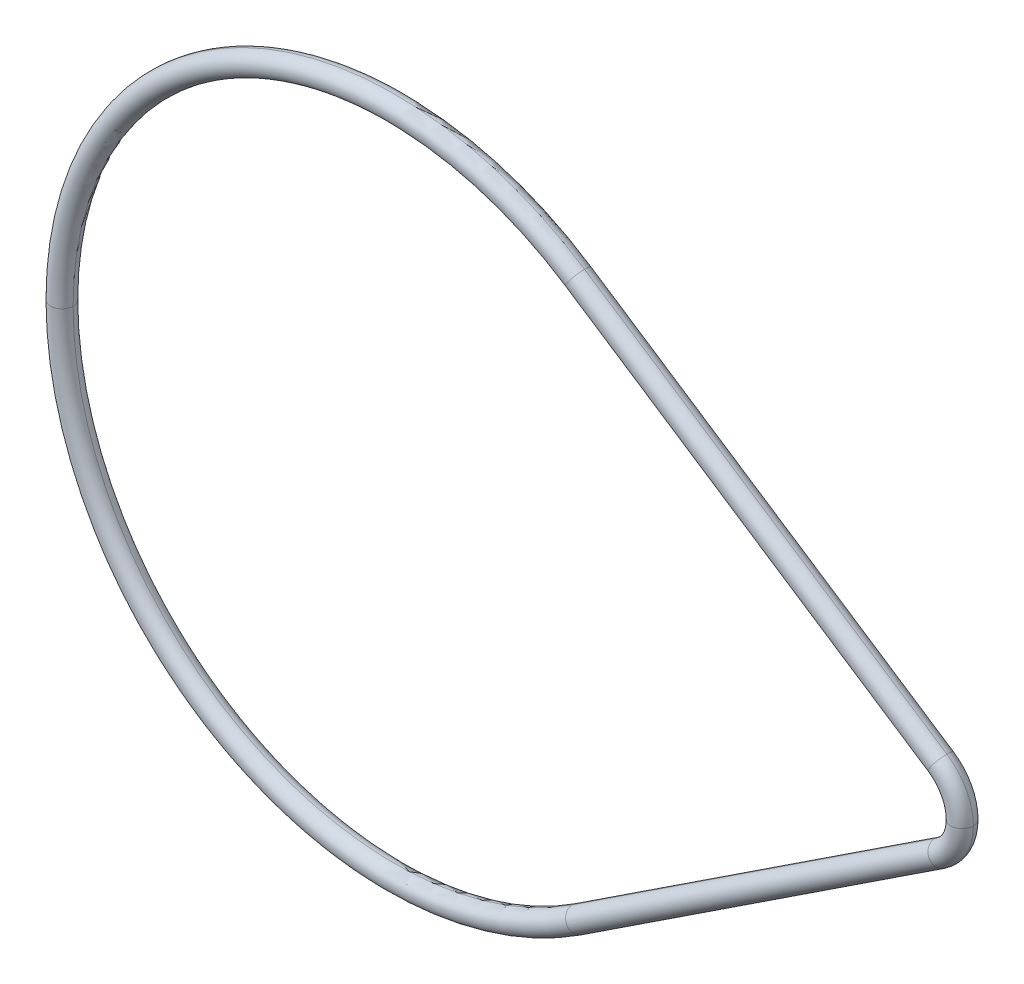
ISO-10303-21;
HEADER;
FILE_DESCRIPTION(('STEP AP214'),'2;1');
FILE_NAME('part.step','',(''),(''),'','','');
FILE_SCHEMA(('AUTOMOTIVE_DESIGN { 1 0 10303 214 1 1 1 1 }'));
ENDSEC;
DATA;
#1=APPLICATION_CONTEXT('core data for automotive mechanical design processes');
#2=APPLICATION_PROTOCOL_DEFINITION('international standard','automotive_design',2000,#1);
#3=PRODUCT_CONTEXT('',#1,'mechanical');
#4=PRODUCT('Part','Part','',(#3));
#5=PRODUCT_RELATED_PRODUCT_CATEGORY('part','',(#4));
#6=PRODUCT_DEFINITION_FORMATION('','',#4);
#7=PRODUCT_DEFINITION_CONTEXT('part definition',#1,'design');
#8=PRODUCT_DEFINITION('design','',#6,#7);
#9=PRODUCT_DEFINITION_SHAPE('','',#8);
#10=(LENGTH_UNIT() NAMED_UNIT(*) SI_UNIT(.MILLI.,.METRE.));
#11=(NAMED_UNIT(*) PLANE_ANGLE_UNIT() SI_UNIT($,.RADIAN.));
#12=(NAMED_UNIT(*) SI_UNIT($,.STERADIAN.) SOLID_ANGLE_UNIT());
#13=UNCERTAINTY_MEASURE_WITH_UNIT(LENGTH_MEASURE(1.E-05),#10,'distance_accuracy_value','');
#14=(GEOMETRIC_REPRESENTATION_CONTEXT(3) GLOBAL_UNCERTAINTY_ASSIGNED_CONTEXT((#13)) GLOBAL_UNIT_ASSIGNED_CONTEXT((#10,
#11,#12)) REPRESENTATION_CONTEXT('',''));
#15=CARTESIAN_POINT('',(0.,0.,0.));
#16=DIRECTION('',(0.,0.,1.));
#17=DIRECTION('',(1.,0.,0.));
#18=AXIS2_PLACEMENT_3D('',#15,#16,#17);
#19=CARTESIAN_POINT('',(46.,0.,0.));
#20=DIRECTION('',(0.,0.,1.));
#21=DIRECTION('',(1.,0.,0.));
#22=AXIS2_PLACEMENT_3D('',#19,#20,#21);
#23=TOROIDAL_SURFACE('',#22,4.2,0.995);
#24=CARTESIAN_POINT('',(46.,0.,0.));
#25=DIRECTION('',(0.,0.,1.));
#26=DIRECTION('',(0.550000000014294,-0.83516465441509,0.));
#27=AXIS2_PLACEMENT_3D('',#24,#25,#26);
#28=CIRCLE('',#27,3.205);
#29=CARTESIAN_POINT('',(47.76275000005,-2.6767027174,0.));
#30=VERTEX_POINT('',#29);
#31=CARTESIAN_POINT('',(49.205,0.,0.));
#32=VERTEX_POINT('',#31);
#33=EDGE_CURVE('E11',#30,#32,#28,.T.);
#34=ORIENTED_EDGE('',*,*,#33,.T.);
#35=CARTESIAN_POINT('',(50.2,0.,0.));
#36=DIRECTION('',(0.,-1.,0.));
#37=DIRECTION('',(-1.,0.,0.));
#38=AXIS2_PLACEMENT_3D('',#35,#36,#37);
#39=CIRCLE('',#38,0.995);
#40=CARTESIAN_POINT('',(51.195,0.,0.));
#41=VERTEX_POINT('',#40);
#42=EDGE_CURVE('E29',#32,#41,#39,.T.);
#43=ORIENTED_EDGE('',*,*,#42,.T.);
#44=CARTESIAN_POINT('',(46.,0.,0.));
#45=DIRECTION('',(0.,0.,1.));
#46=DIRECTION('',(0.550000000014294,-0.83516465441509,0.));
#47=AXIS2_PLACEMENT_3D('',#44,#45,#46);
#48=CIRCLE('',#47,5.195);
#49=CARTESIAN_POINT('',(48.85725000007,-4.338680379686,0.));
#50=VERTEX_POINT('',#49);
#51=EDGE_CURVE('E212',#50,#41,#48,.T.);
#52=ORIENTED_EDGE('',*,*,#51,.F.);
#53=CARTESIAN_POINT('',(48.31000000006,-3.507691548543,0.));
#54=DIRECTION('',(0.83516465441509,0.550000000014294,0.));
#55=DIRECTION('',(0.550000000014294,-0.83516465441509,0.));
#56=AXIS2_PLACEMENT_3D('',#53,#54,#55);
#57=CIRCLE('',#56,0.995);
#58=EDGE_CURVE('E196',#50,#30,#57,.T.);
#59=ORIENTED_EDGE('',*,*,#58,.T.);
#60=EDGE_LOOP('',(#34,#43,#52,#59));
#61=FACE_BOUND('',#60,.T.);
#62=ADVANCED_FACE('F18',(#61),#23,.T.);
#63=CARTESIAN_POINT('',(16.22500000006,-24.63735730548,0.));
#64=DIRECTION('',(0.835164654424502,0.55,0.));
#65=DIRECTION('',(-0.55,0.835164654424502,0.));
#66=AXIS2_PLACEMENT_3D('',#63,#64,#65);
#67=CYLINDRICAL_SURFACE('',#66,0.995);
#68=DIRECTION('',(0.835164654424502,0.55,0.));
#69=VECTOR('',#68,1.);
#70=CARTESIAN_POINT('',(15.67775000006,-23.80636847433,0.));
#71=LINE('',#70,#69);
#72=CARTESIAN_POINT('',(15.67775000006,-23.80636847433,0.));
#73=VERTEX_POINT('',#72);
#74=EDGE_CURVE('E200',#73,#30,#71,.T.);
#75=ORIENTED_EDGE('',*,*,#74,.T.);
#76=ORIENTED_EDGE('',*,*,#58,.F.);
#77=DIRECTION('',(0.835164654424502,0.55,0.));
#78=VECTOR('',#77,1.);
#79=CARTESIAN_POINT('',(16.77225000006,-25.46834613664,0.));
#80=LINE('',#79,#78);
#81=CARTESIAN_POINT('',(16.77225000006,-25.46834613664,0.));
#82=VERTEX_POINT('',#81);
#83=EDGE_CURVE('E214',#82,#50,#80,.T.);
#84=ORIENTED_EDGE('',*,*,#83,.F.);
#85=CARTESIAN_POINT('',(16.22500000006,-24.63735730548,0.));
#86=DIRECTION('',(-0.83516465442319,-0.550000000001994,0.));
#87=DIRECTION('',(-0.550000000001994,0.83516465442319,0.));
#88=AXIS2_PLACEMENT_3D('',#85,#86,#87);
#89=CIRCLE('',#88,0.995);
#90=EDGE_CURVE('E190',#73,#82,#89,.T.);
#91=ORIENTED_EDGE('',*,*,#90,.F.);
#92=EDGE_LOOP('',(#75,#76,#84,#91));
#93=FACE_BOUND('',#92,.T.);
#94=ADVANCED_FACE('F366',(#93),#67,.T.);
#95=CARTESIAN_POINT('',(0.,0.,0.));
#96=DIRECTION('',(0.,0.,-1.));
#97=DIRECTION('',(-1.,0.,0.));
#98=AXIS2_PLACEMENT_3D('',#95,#96,#97);
#99=TOROIDAL_SURFACE('',#98,29.5,0.995);
#100=CARTESIAN_POINT('',(0.,0.,0.));
#101=DIRECTION('',(0.,0.,-1.));
#102=DIRECTION('',(0.550000000001994,-0.83516465442319,0.));
#103=AXIS2_PLACEMENT_3D('',#100,#101,#102);
#104=CIRCLE('',#103,30.495);
#105=CARTESIAN_POINT('',(-30.495,0.,0.));
#106=VERTEX_POINT('',#105);
#107=EDGE_CURVE('E219',#82,#106,#104,.T.);
#108=ORIENTED_EDGE('',*,*,#107,.T.);
#109=CARTESIAN_POINT('',(-29.5,0.,0.));
#110=DIRECTION('',(0.,-1.,0.));
#111=DIRECTION('',(-1.,0.,0.));
#112=AXIS2_PLACEMENT_3D('',#109,#110,#111);
#113=CIRCLE('',#112,0.995);
#114=CARTESIAN_POINT('',(-28.505,0.,0.));
#115=VERTEX_POINT('',#114);
#116=EDGE_CURVE('E194',#106,#115,#113,.T.);
#117=ORIENTED_EDGE('',*,*,#116,.T.);
#118=CARTESIAN_POINT('',(0.,0.,0.));
#119=DIRECTION('',(0.,0.,-1.));
#120=DIRECTION('',(0.550000000001994,-0.83516465442319,0.));
#121=AXIS2_PLACEMENT_3D('',#118,#119,#120);
#122=CIRCLE('',#121,28.505);
#123=EDGE_CURVE('E195',#73,#115,#122,.T.);
#124=ORIENTED_EDGE('',*,*,#123,.F.);
#125=ORIENTED_EDGE('',*,*,#90,.T.);
#126=EDGE_LOOP('',(#108,#117,#124,#125));
#127=FACE_BOUND('',#126,.T.);
#128=ADVANCED_FACE('F344',(#127),#99,.T.);
#129=CARTESIAN_POINT('',(0.,0.,0.));
#130=DIRECTION('',(0.,0.,-1.));
#131=DIRECTION('',(-1.,0.,0.));
#132=AXIS2_PLACEMENT_3D('',#129,#130,#131);
#133=TOROIDAL_SURFACE('',#132,29.5,0.995);
#134=ORIENTED_EDGE('',*,*,#123,.T.);
#135=CARTESIAN_POINT('',(-29.5,0.,0.));
#136=DIRECTION('',(0.,-1.,0.));
#137=DIRECTION('',(1.,0.,0.));
#138=AXIS2_PLACEMENT_3D('',#135,#136,#137);
#139=CIRCLE('',#138,0.995);
#140=EDGE_CURVE('E211',#115,#106,#139,.T.);
#141=ORIENTED_EDGE('',*,*,#140,.T.);
#142=ORIENTED_EDGE('',*,*,#107,.F.);
#143=CARTESIAN_POINT('',(16.22500000006,-24.63735730548,0.));
#144=DIRECTION('',(-0.83516465442319,-0.550000000001994,0.));
#145=DIRECTION('',(0.550000000001994,-0.83516465442319,0.));
#146=AXIS2_PLACEMENT_3D('',#143,#144,#145);
#147=CIRCLE('',#146,0.995);
#148=EDGE_CURVE('E281',#82,#73,#147,.T.);
#149=ORIENTED_EDGE('',*,*,#148,.T.);
#150=EDGE_LOOP('',(#134,#141,#142,#149));
#151=FACE_BOUND('',#150,.T.);
#152=ADVANCED_FACE('F353',(#151),#133,.T.);
#153=CARTESIAN_POINT('',(16.22500000006,-24.63735730548,0.));
#154=DIRECTION('',(0.835164654424502,0.55,0.));
#155=DIRECTION('',(-0.55,0.835164654424502,0.));
#156=AXIS2_PLACEMENT_3D('',#153,#154,#155);
#157=CYLINDRICAL_SURFACE('',#156,0.995);
#158=ORIENTED_EDGE('',*,*,#83,.T.);
#159=CARTESIAN_POINT('',(48.31000000006,-3.507691548543,0.));
#160=DIRECTION('',(0.83516465441509,0.550000000014294,0.));
#161=DIRECTION('',(-0.550000000014294,0.83516465441509,0.));
#162=AXIS2_PLACEMENT_3D('',#159,#160,#161);
#163=CIRCLE('',#162,0.995);
#164=EDGE_CURVE('E160',#30,#50,#163,.T.);
#165=ORIENTED_EDGE('',*,*,#164,.F.);
#166=ORIENTED_EDGE('',*,*,#74,.F.);
#167=ORIENTED_EDGE('',*,*,#148,.F.);
#168=EDGE_LOOP('',(#158,#165,#166,#167));
#169=FACE_BOUND('',#168,.T.);
#170=ADVANCED_FACE('F357',(#169),#157,.T.);
#171=CARTESIAN_POINT('',(46.,0.,0.));
#172=DIRECTION('',(0.,0.,1.));
#173=DIRECTION('',(1.,0.,0.));
#174=AXIS2_PLACEMENT_3D('',#171,#172,#173);
#175=TOROIDAL_SURFACE('',#174,4.2,0.995);
#176=ORIENTED_EDGE('',*,*,#51,.T.);
#177=CARTESIAN_POINT('',(50.2,0.,0.));
#178=DIRECTION('',(0.,-1.,0.));
#179=DIRECTION('',(1.,0.,0.));
#180=AXIS2_PLACEMENT_3D('',#177,#178,#179);
#181=CIRCLE('',#180,0.995);
#182=EDGE_CURVE('E43',#41,#32,#181,.T.);
#183=ORIENTED_EDGE('',*,*,#182,.T.);
#184=ORIENTED_EDGE('',*,*,#33,.F.);
#185=ORIENTED_EDGE('',*,*,#164,.T.);
#186=EDGE_LOOP('',(#176,#183,#184,#185));
#187=FACE_BOUND('',#186,.T.);
#188=ADVANCED_FACE('F368',(#187),#175,.T.);
#189=CARTESIAN_POINT('',(46.,0.,0.));
#190=DIRECTION('',(0.,0.,1.));
#191=DIRECTION('',(1.,0.,0.));
#192=AXIS2_PLACEMENT_3D('',#189,#190,#191);
#193=TOROIDAL_SURFACE('',#192,4.2,0.995);
#194=CARTESIAN_POINT('',(46.,0.,0.));
#195=DIRECTION('',(0.,0.,1.));
#196=DIRECTION('',(1.,0.,0.));
#197=AXIS2_PLACEMENT_3D('',#194,#195,#196);
#198=CIRCLE('',#197,3.205);
#199=CARTESIAN_POINT('',(47.76274999996,2.67670271746,0.));
#200=VERTEX_POINT('',#199);
#201=EDGE_CURVE('E143',#32,#200,#198,.T.);
#202=ORIENTED_EDGE('',*,*,#201,.F.);
#203=ORIENTED_EDGE('',*,*,#182,.F.);
#204=CARTESIAN_POINT('',(46.,0.,0.));
#205=DIRECTION('',(0.,0.,1.));
#206=DIRECTION('',(1.,0.,0.));
#207=AXIS2_PLACEMENT_3D('',#204,#205,#206);
#208=CIRCLE('',#207,5.195);
#209=CARTESIAN_POINT('',(48.85724999993,4.338680379783,0.));
#210=VERTEX_POINT('',#209);
#211=EDGE_CURVE('E154',#41,#210,#208,.T.);
#212=ORIENTED_EDGE('',*,*,#211,.T.);
#213=CARTESIAN_POINT('',(48.30999999994,3.507691548622,0.));
#214=DIRECTION('',(0.835164654433716,-0.549999999986011,0.));
#215=DIRECTION('',(0.549999999986011,0.835164654433716,0.));
#216=AXIS2_PLACEMENT_3D('',#213,#214,#215);
#217=CIRCLE('',#216,0.995);
#218=EDGE_CURVE('E147',#210,#200,#217,.T.);
#219=ORIENTED_EDGE('',*,*,#218,.T.);
#220=EDGE_LOOP('',(#202,#203,#212,#219));
#221=FACE_BOUND('',#220,.T.);
#222=ADVANCED_FACE('F157',(#221),#193,.T.);
#223=CARTESIAN_POINT('',(16.22499999994,24.63735730556,0.));
#224=DIRECTION('',(0.835164654424502,-0.55,0.));
#225=DIRECTION('',(0.55,0.835164654424502,0.));
#226=AXIS2_PLACEMENT_3D('',#223,#224,#225);
#227=CYLINDRICAL_SURFACE('',#226,0.995);
#228=DIRECTION('',(0.835164654424502,-0.55,0.));
#229=VECTOR('',#228,1.);
#230=CARTESIAN_POINT('',(15.67775000008,23.80636847432,0.));
#231=LINE('',#230,#229);
#232=CARTESIAN_POINT('',(15.67775000008,23.80636847432,0.));
#233=VERTEX_POINT('',#232);
#234=EDGE_CURVE('E150',#233,#200,#231,.T.);
#235=ORIENTED_EDGE('',*,*,#234,.T.);
#236=ORIENTED_EDGE('',*,*,#218,.F.);
#237=DIRECTION('',(0.835164654424502,-0.55,0.));
#238=VECTOR('',#237,1.);
#239=CARTESIAN_POINT('',(16.77225000008,25.46834613662,0.));
#240=LINE('',#239,#238);
#241=CARTESIAN_POINT('',(16.77225000008,25.46834613662,0.));
#242=VERTEX_POINT('',#241);
#243=EDGE_CURVE('E132',#242,#210,#240,.T.);
#244=ORIENTED_EDGE('',*,*,#243,.F.);
#245=CARTESIAN_POINT('',(16.22500000008,24.63735730547,0.));
#246=DIRECTION('',(-0.835164654422718,0.550000000002712,0.));
#247=DIRECTION('',(-0.550000000002712,-0.835164654422718,0.));
#248=AXIS2_PLACEMENT_3D('',#245,#246,#247);
#249=CIRCLE('',#248,0.995);
#250=EDGE_CURVE('E206',#233,#242,#249,.T.);
#251=ORIENTED_EDGE('',*,*,#250,.F.);
#252=EDGE_LOOP('',(#235,#236,#244,#251));
#253=FACE_BOUND('',#252,.T.);
#254=ADVANCED_FACE('F149',(#253),#227,.T.);
#255=CARTESIAN_POINT('',(0.,0.,0.));
#256=DIRECTION('',(0.,0.,-1.));
#257=DIRECTION('',(-1.,0.,0.));
#258=AXIS2_PLACEMENT_3D('',#255,#256,#257);
#259=TOROIDAL_SURFACE('',#258,29.5,0.995);
#260=CARTESIAN_POINT('',(0.,0.,0.));
#261=DIRECTION('',(0.,0.,-1.));
#262=DIRECTION('',(-1.,0.,0.));
#263=AXIS2_PLACEMENT_3D('',#260,#261,#262);
#264=CIRCLE('',#263,30.495);
#265=EDGE_CURVE('E204',#106,#242,#264,.T.);
#266=ORIENTED_EDGE('',*,*,#265,.F.);
#267=ORIENTED_EDGE('',*,*,#140,.F.);
#268=CARTESIAN_POINT('',(0.,0.,0.));
#269=DIRECTION('',(0.,0.,-1.));
#270=DIRECTION('',(-1.,0.,0.));
#271=AXIS2_PLACEMENT_3D('',#268,#269,#270);
#272=CIRCLE('',#271,28.505);
#273=EDGE_CURVE('E233',#115,#233,#272,.T.);
#274=ORIENTED_EDGE('',*,*,#273,.T.);
#275=ORIENTED_EDGE('',*,*,#250,.T.);
#276=EDGE_LOOP('',(#266,#267,#274,#275));
#277=FACE_BOUND('',#276,.T.);
#278=ADVANCED_FACE('F351',(#277),#259,.T.);
#279=CARTESIAN_POINT('',(0.,0.,0.));
#280=DIRECTION('',(0.,0.,-1.));
#281=DIRECTION('',(-1.,0.,0.));
#282=AXIS2_PLACEMENT_3D('',#279,#280,#281);
#283=TOROIDAL_SURFACE('',#282,29.5,0.995);
#284=ORIENTED_EDGE('',*,*,#273,.F.);
#285=ORIENTED_EDGE('',*,*,#116,.F.);
#286=ORIENTED_EDGE('',*,*,#265,.T.);
#287=CARTESIAN_POINT('',(16.22500000008,24.63735730547,0.));
#288=DIRECTION('',(-0.835164654422718,0.550000000002712,0.));
#289=DIRECTION('',(0.550000000002712,0.835164654422718,0.));
#290=AXIS2_PLACEMENT_3D('',#287,#288,#289);
#291=CIRCLE('',#290,0.995);
#292=EDGE_CURVE('E139',#242,#233,#291,.T.);
#293=ORIENTED_EDGE('',*,*,#292,.T.);
#294=EDGE_LOOP('',(#284,#285,#286,#293));
#295=FACE_BOUND('',#294,.T.);
#296=ADVANCED_FACE('F349',(#295),#283,.T.);
#297=CARTESIAN_POINT('',(16.22499999994,24.63735730556,0.));
#298=DIRECTION('',(0.835164654424502,-0.55,0.));
#299=DIRECTION('',(0.55,0.835164654424502,0.));
#300=AXIS2_PLACEMENT_3D('',#297,#298,#299);
#301=CYLINDRICAL_SURFACE('',#300,0.995);
#302=ORIENTED_EDGE('',*,*,#243,.T.);
#303=CARTESIAN_POINT('',(48.30999999994,3.507691548622,0.));
#304=DIRECTION('',(0.835164654433716,-0.549999999986011,0.));
#305=DIRECTION('',(-0.549999999986011,-0.835164654433716,0.));
#306=AXIS2_PLACEMENT_3D('',#303,#304,#305);
#307=CIRCLE('',#306,0.995);
#308=EDGE_CURVE('E137',#200,#210,#307,.T.);
#309=ORIENTED_EDGE('',*,*,#308,.F.);
#310=ORIENTED_EDGE('',*,*,#234,.F.);
#311=ORIENTED_EDGE('',*,*,#292,.F.);
#312=EDGE_LOOP('',(#302,#309,#310,#311));
#313=FACE_BOUND('',#312,.T.);
#314=ADVANCED_FACE('F134',(#313),#301,.T.);
#315=CARTESIAN_POINT('',(46.,0.,0.));
#316=DIRECTION('',(0.,0.,1.));
#317=DIRECTION('',(1.,0.,0.));
#318=AXIS2_PLACEMENT_3D('',#315,#316,#317);
#319=TOROIDAL_SURFACE('',#318,4.2,0.995);
#320=ORIENTED_EDGE('',*,*,#211,.F.);
#321=ORIENTED_EDGE('',*,*,#42,.F.);
#322=ORIENTED_EDGE('',*,*,#201,.T.);
#323=ORIENTED_EDGE('',*,*,#308,.T.);
#324=EDGE_LOOP('',(#320,#321,#322,#323));
#325=FACE_BOUND('',#324,.T.);
#326=ADVANCED_FACE('F162',(#325),#319,.T.);
#327=CLOSED_SHELL('',(#62,#94,#128,#152,#170,#188,#222,#254,#278,#296,#314,#326));
#328=CARTESIAN_POINT('',(46.,0.,0.));
#329=DIRECTION('',(0.,0.,1.));
#330=DIRECTION('',(1.,0.,0.));
#331=AXIS2_PLACEMENT_3D('',#328,#329,#330);
#332=TOROIDAL_SURFACE('',#331,4.2,0.1);
#333=CARTESIAN_POINT('',(48.30999999994,3.507691548621,0.));
#334=DIRECTION('',(-0.835164654433518,0.549999999986312,0.));
#335=DIRECTION('',(0.549999999986312,0.835164654433518,0.));
#336=AXIS2_PLACEMENT_3D('',#333,#334,#335);
#337=CIRCLE('',#336,0.1);
#338=CARTESIAN_POINT('',(48.36499999994,3.591208014064,0.));
#339=VERTEX_POINT('',#338);
#340=CARTESIAN_POINT('',(48.25499999994,3.424175083177,0.));
#341=VERTEX_POINT('',#340);
#342=EDGE_CURVE('E164',#339,#341,#337,.T.);
#343=ORIENTED_EDGE('',*,*,#342,.T.);
#344=CARTESIAN_POINT('',(46.,0.,0.));
#345=DIRECTION('',(0.,0.,1.));
#346=DIRECTION('',(1.,0.,0.));
#347=AXIS2_PLACEMENT_3D('',#344,#345,#346);
#348=CIRCLE('',#347,4.1);
#349=CARTESIAN_POINT('',(50.1,0.,0.));
#350=VERTEX_POINT('',#349);
#351=EDGE_CURVE('E183',#350,#341,#348,.T.);
#352=ORIENTED_EDGE('',*,*,#351,.F.);
#353=CARTESIAN_POINT('',(50.2,0.,0.));
#354=DIRECTION('',(0.,-1.,0.));
#355=DIRECTION('',(-1.,0.,0.));
#356=AXIS2_PLACEMENT_3D('',#353,#354,#355);
#357=CIRCLE('',#356,0.1);
#358=CARTESIAN_POINT('',(50.3,0.,0.));
#359=VERTEX_POINT('',#358);
#360=EDGE_CURVE('E173',#350,#359,#357,.T.);
#361=ORIENTED_EDGE('',*,*,#360,.T.);
#362=CARTESIAN_POINT('',(46.,0.,0.));
#363=DIRECTION('',(0.,0.,1.));
#364=DIRECTION('',(1.,0.,0.));
#365=AXIS2_PLACEMENT_3D('',#362,#363,#364);
#366=CIRCLE('',#365,4.3);
#367=EDGE_CURVE('E252',#359,#339,#366,.T.);
#368=ORIENTED_EDGE('',*,*,#367,.T.);
#369=EDGE_LOOP('',(#343,#352,#361,#368));
#370=FACE_BOUND('',#369,.T.);
#371=ADVANCED_FACE('F327',(#370),#332,.F.);
#372=CARTESIAN_POINT('',(16.22499999994,24.63735730556,0.));
#373=DIRECTION('',(0.835164654424502,-0.55,0.));
#374=DIRECTION('',(0.55,0.835164654424502,0.));
#375=AXIS2_PLACEMENT_3D('',#372,#373,#374);
#376=CYLINDRICAL_SURFACE('',#375,0.1);
#377=CARTESIAN_POINT('',(16.22500000008,24.63735730547,0.));
#378=DIRECTION('',(0.835164654422718,-0.550000000002712,0.));
#379=DIRECTION('',(-0.550000000002712,-0.835164654422718,0.));
#380=AXIS2_PLACEMENT_3D('',#377,#378,#379);
#381=CIRCLE('',#380,0.1);
#382=CARTESIAN_POINT('',(16.17000000008,24.55384084003,0.));
#383=VERTEX_POINT('',#382);
#384=CARTESIAN_POINT('',(16.28000000008,24.72087377091,0.));
#385=VERTEX_POINT('',#384);
#386=EDGE_CURVE('E231',#383,#385,#381,.T.);
#387=ORIENTED_EDGE('',*,*,#386,.F.);
#388=DIRECTION('',(0.835164654424502,-0.55,0.));
#389=VECTOR('',#388,1.);
#390=CARTESIAN_POINT('',(16.17000000008,24.55384084003,0.));
#391=LINE('',#390,#389);
#392=EDGE_CURVE('E248',#383,#341,#391,.T.);
#393=ORIENTED_EDGE('',*,*,#392,.T.);
#394=ORIENTED_EDGE('',*,*,#342,.F.);
#395=DIRECTION('',(0.835164654424502,-0.55,0.));
#396=VECTOR('',#395,1.);
#397=CARTESIAN_POINT('',(16.28000000008,24.72087377091,0.));
#398=LINE('',#397,#396);
#399=EDGE_CURVE('E220',#385,#339,#398,.T.);
#400=ORIENTED_EDGE('',*,*,#399,.F.);
#401=EDGE_LOOP('',(#387,#393,#394,#400));
#402=FACE_BOUND('',#401,.T.);
#403=ADVANCED_FACE('F325',(#402),#376,.F.);
#404=CARTESIAN_POINT('',(0.,0.,0.));
#405=DIRECTION('',(0.,0.,-1.));
#406=DIRECTION('',(-1.,0.,0.));
#407=AXIS2_PLACEMENT_3D('',#404,#405,#406);
#408=TOROIDAL_SURFACE('',#407,29.5,0.1);
#409=ORIENTED_EDGE('',*,*,#386,.T.);
#410=CARTESIAN_POINT('',(0.,0.,0.));
#411=DIRECTION('',(0.,0.,-1.));
#412=DIRECTION('',(-1.,0.,0.));
#413=AXIS2_PLACEMENT_3D('',#410,#411,#412);
#414=CIRCLE('',#413,29.6);
#415=CARTESIAN_POINT('',(-29.6,0.,0.));
#416=VERTEX_POINT('',#415);
#417=EDGE_CURVE('E223',#416,#385,#414,.T.);
#418=ORIENTED_EDGE('',*,*,#417,.F.);
#419=CARTESIAN_POINT('',(-29.5,0.,0.));
#420=DIRECTION('',(0.,-1.,0.));
#421=DIRECTION('',(-1.,0.,0.));
#422=AXIS2_PLACEMENT_3D('',#419,#420,#421);
#423=CIRCLE('',#422,0.1);
#424=CARTESIAN_POINT('',(-29.4,0.,0.));
#425=VERTEX_POINT('',#424);
#426=EDGE_CURVE('E227',#416,#425,#423,.T.);
#427=ORIENTED_EDGE('',*,*,#426,.T.);
#428=CARTESIAN_POINT('',(0.,0.,0.));
#429=DIRECTION('',(0.,0.,-1.));
#430=DIRECTION('',(-1.,0.,0.));
#431=AXIS2_PLACEMENT_3D('',#428,#429,#430);
#432=CIRCLE('',#431,29.4);
#433=EDGE_CURVE('E232',#425,#383,#432,.T.);
#434=ORIENTED_EDGE('',*,*,#433,.T.);
#435=EDGE_LOOP('',(#409,#418,#427,#434));
#436=FACE_BOUND('',#435,.T.);
#437=ADVANCED_FACE('F315',(#436),#408,.F.);
#438=CARTESIAN_POINT('',(0.,0.,0.));
#439=DIRECTION('',(0.,0.,-1.));
#440=DIRECTION('',(-1.,0.,0.));
#441=AXIS2_PLACEMENT_3D('',#438,#439,#440);
#442=TOROIDAL_SURFACE('',#441,29.5,0.1);
#443=CARTESIAN_POINT('',(16.22500000008,24.63735730547,0.));
#444=DIRECTION('',(0.835164654422718,-0.550000000002712,0.));
#445=DIRECTION('',(0.550000000002712,0.835164654422718,0.));
#446=AXIS2_PLACEMENT_3D('',#443,#444,#445);
#447=CIRCLE('',#446,0.1);
#448=EDGE_CURVE('E247',#385,#383,#447,.T.);
#449=ORIENTED_EDGE('',*,*,#448,.T.);
#450=ORIENTED_EDGE('',*,*,#433,.F.);
#451=CARTESIAN_POINT('',(-29.5,0.,0.));
#452=DIRECTION('',(0.,-1.,0.));
#453=DIRECTION('',(1.,0.,0.));
#454=AXIS2_PLACEMENT_3D('',#451,#452,#453);
#455=CIRCLE('',#454,0.1);
#456=EDGE_CURVE('E243',#425,#416,#455,.T.);
#457=ORIENTED_EDGE('',*,*,#456,.T.);
#458=ORIENTED_EDGE('',*,*,#417,.T.);
#459=EDGE_LOOP('',(#449,#450,#457,#458));
#460=FACE_BOUND('',#459,.T.);
#461=ADVANCED_FACE('F309',(#460),#442,.F.);
#462=CARTESIAN_POINT('',(16.22499999994,24.63735730556,0.));
#463=DIRECTION('',(0.835164654424502,-0.55,0.));
#464=DIRECTION('',(0.55,0.835164654424502,0.));
#465=AXIS2_PLACEMENT_3D('',#462,#463,#464);
#466=CYLINDRICAL_SURFACE('',#465,0.1);
#467=ORIENTED_EDGE('',*,*,#448,.F.);
#468=ORIENTED_EDGE('',*,*,#399,.T.);
#469=CARTESIAN_POINT('',(48.30999999994,3.507691548621,0.));
#470=DIRECTION('',(-0.835164654433518,0.549999999986312,0.));
#471=DIRECTION('',(-0.549999999986312,-0.835164654433518,0.));
#472=AXIS2_PLACEMENT_3D('',#469,#470,#471);
#473=CIRCLE('',#472,0.1);
#474=EDGE_CURVE('E182',#341,#339,#473,.T.);
#475=ORIENTED_EDGE('',*,*,#474,.F.);
#476=ORIENTED_EDGE('',*,*,#392,.F.);
#477=EDGE_LOOP('',(#467,#468,#475,#476));
#478=FACE_BOUND('',#477,.T.);
#479=ADVANCED_FACE('F321',(#478),#466,.F.);
#480=CARTESIAN_POINT('',(46.,0.,0.));
#481=DIRECTION('',(0.,0.,1.));
#482=DIRECTION('',(1.,0.,0.));
#483=AXIS2_PLACEMENT_3D('',#480,#481,#482);
#484=TOROIDAL_SURFACE('',#483,4.2,0.1);
#485=ORIENTED_EDGE('',*,*,#474,.T.);
#486=ORIENTED_EDGE('',*,*,#367,.F.);
#487=CARTESIAN_POINT('',(50.2,0.,0.));
#488=DIRECTION('',(0.,-1.,0.));
#489=DIRECTION('',(1.,0.,0.));
#490=AXIS2_PLACEMENT_3D('',#487,#488,#489);
#491=CIRCLE('',#490,0.1);
#492=EDGE_CURVE('E179',#359,#350,#491,.T.);
#493=ORIENTED_EDGE('',*,*,#492,.T.);
#494=ORIENTED_EDGE('',*,*,#351,.T.);
#495=EDGE_LOOP('',(#485,#486,#493,#494));
#496=FACE_BOUND('',#495,.T.);
#497=ADVANCED_FACE('F332',(#496),#484,.F.);
#498=CARTESIAN_POINT('',(46.,0.,0.));
#499=DIRECTION('',(0.,0.,1.));
#500=DIRECTION('',(1.,0.,0.));
#501=AXIS2_PLACEMENT_3D('',#498,#499,#500);
#502=TOROIDAL_SURFACE('',#501,4.2,0.1);
#503=CARTESIAN_POINT('',(48.31000000006,-3.507691548544,0.));
#504=DIRECTION('',(-0.835164654415289,-0.550000000013993,0.));
#505=DIRECTION('',(0.550000000013992,-0.835164654415289,0.));
#506=AXIS2_PLACEMENT_3D('',#503,#504,#505);
#507=CIRCLE('',#506,0.1);
#508=CARTESIAN_POINT('',(48.36500000006,-3.591208013986,0.));
#509=VERTEX_POINT('',#508);
#510=CARTESIAN_POINT('',(48.25500000006,-3.424175083102,0.));
#511=VERTEX_POINT('',#510);
#512=EDGE_CURVE('E203',#509,#511,#507,.T.);
#513=ORIENTED_EDGE('',*,*,#512,.T.);
#514=CARTESIAN_POINT('',(46.,0.,0.));
#515=DIRECTION('',(0.,0.,1.));
#516=DIRECTION('',(0.550000000013992,-0.835164654415289,0.));
#517=AXIS2_PLACEMENT_3D('',#514,#515,#516);
#518=CIRCLE('',#517,4.1);
#519=EDGE_CURVE('E226',#511,#350,#518,.T.);
#520=ORIENTED_EDGE('',*,*,#519,.T.);
#521=ORIENTED_EDGE('',*,*,#492,.F.);
#522=CARTESIAN_POINT('',(46.,0.,0.));
#523=DIRECTION('',(0.,0.,1.));
#524=DIRECTION('',(0.550000000013992,-0.835164654415289,0.));
#525=AXIS2_PLACEMENT_3D('',#522,#523,#524);
#526=CIRCLE('',#525,4.3);
#527=EDGE_CURVE('E22',#509,#359,#526,.T.);
#528=ORIENTED_EDGE('',*,*,#527,.F.);
#529=EDGE_LOOP('',(#513,#520,#521,#528));
#530=FACE_BOUND('',#529,.T.);
#531=ADVANCED_FACE('F20',(#530),#502,.F.);
#532=CARTESIAN_POINT('',(16.22500000006,-24.63735730548,0.));
#533=DIRECTION('',(0.835164654424502,0.55,0.));
#534=DIRECTION('',(-0.55,0.835164654424502,0.));
#535=AXIS2_PLACEMENT_3D('',#532,#533,#534);
#536=CYLINDRICAL_SURFACE('',#535,0.1);
#537=CARTESIAN_POINT('',(16.22500000006,-24.63735730548,0.));
#538=DIRECTION('',(0.83516465442319,0.550000000001994,0.));
#539=DIRECTION('',(-0.550000000001994,0.83516465442319,0.));
#540=AXIS2_PLACEMENT_3D('',#537,#538,#539);
#541=CIRCLE('',#540,0.1);
#542=CARTESIAN_POINT('',(16.17000000006,-24.55384084004,0.));
#543=VERTEX_POINT('',#542);
#544=CARTESIAN_POINT('',(16.28000000006,-24.72087377093,0.));
#545=VERTEX_POINT('',#544);
#546=EDGE_CURVE('E184',#543,#545,#541,.T.);
#547=ORIENTED_EDGE('',*,*,#546,.F.);
#548=DIRECTION('',(0.835164654424502,0.55,0.));
#549=VECTOR('',#548,1.);
#550=CARTESIAN_POINT('',(16.17000000006,-24.55384084004,0.));
#551=LINE('',#550,#549);
#552=EDGE_CURVE('E188',#543,#511,#551,.T.);
#553=ORIENTED_EDGE('',*,*,#552,.T.);
#554=ORIENTED_EDGE('',*,*,#512,.F.);
#555=DIRECTION('',(0.835164654424502,0.55,0.));
#556=VECTOR('',#555,1.);
#557=CARTESIAN_POINT('',(16.28000000006,-24.72087377093,0.));
#558=LINE('',#557,#556);
#559=EDGE_CURVE('E263',#545,#509,#558,.T.);
#560=ORIENTED_EDGE('',*,*,#559,.F.);
#561=EDGE_LOOP('',(#547,#553,#554,#560));
#562=FACE_BOUND('',#561,.T.);
#563=ADVANCED_FACE('F391',(#562),#536,.F.);
#564=CARTESIAN_POINT('',(0.,0.,0.));
#565=DIRECTION('',(0.,0.,-1.));
#566=DIRECTION('',(-1.,0.,0.));
#567=AXIS2_PLACEMENT_3D('',#564,#565,#566);
#568=TOROIDAL_SURFACE('',#567,29.5,0.1);
#569=ORIENTED_EDGE('',*,*,#546,.T.);
#570=CARTESIAN_POINT('',(0.,0.,0.));
#571=DIRECTION('',(0.,0.,-1.));
#572=DIRECTION('',(0.550000000001994,-0.83516465442319,0.));
#573=AXIS2_PLACEMENT_3D('',#570,#571,#572);
#574=CIRCLE('',#573,29.6);
#575=EDGE_CURVE('E189',#545,#416,#574,.T.);
#576=ORIENTED_EDGE('',*,*,#575,.T.);
#577=ORIENTED_EDGE('',*,*,#456,.F.);
#578=CARTESIAN_POINT('',(0.,0.,0.));
#579=DIRECTION('',(0.,0.,-1.));
#580=DIRECTION('',(0.550000000001994,-0.83516465442319,0.));
#581=AXIS2_PLACEMENT_3D('',#578,#579,#580);
#582=CIRCLE('',#581,29.4);
#583=EDGE_CURVE('E259',#543,#425,#582,.T.);
#584=ORIENTED_EDGE('',*,*,#583,.F.);
#585=EDGE_LOOP('',(#569,#576,#577,#584));
#586=FACE_BOUND('',#585,.T.);
#587=ADVANCED_FACE('F393',(#586),#568,.F.);
#588=CARTESIAN_POINT('',(0.,0.,0.));
#589=DIRECTION('',(0.,0.,-1.));
#590=DIRECTION('',(-1.,0.,0.));
#591=AXIS2_PLACEMENT_3D('',#588,#589,#590);
#592=TOROIDAL_SURFACE('',#591,29.5,0.1);
#593=CARTESIAN_POINT('',(16.22500000006,-24.63735730548,0.));
#594=DIRECTION('',(0.83516465442319,0.550000000001994,0.));
#595=DIRECTION('',(0.550000000001994,-0.83516465442319,0.));
#596=AXIS2_PLACEMENT_3D('',#593,#594,#595);
#597=CIRCLE('',#596,0.1);
#598=EDGE_CURVE('E240',#545,#543,#597,.T.);
#599=ORIENTED_EDGE('',*,*,#598,.T.);
#600=ORIENTED_EDGE('',*,*,#583,.T.);
#601=ORIENTED_EDGE('',*,*,#426,.F.);
#602=ORIENTED_EDGE('',*,*,#575,.F.);
#603=EDGE_LOOP('',(#599,#600,#601,#602));
#604=FACE_BOUND('',#603,.T.);
#605=ADVANCED_FACE('F556',(#604),#592,.F.);
#606=CARTESIAN_POINT('',(16.22500000006,-24.63735730548,0.));
#607=DIRECTION('',(0.835164654424502,0.55,0.));
#608=DIRECTION('',(-0.55,0.835164654424502,0.));
#609=AXIS2_PLACEMENT_3D('',#606,#607,#608);
#610=CYLINDRICAL_SURFACE('',#609,0.1);
#611=ORIENTED_EDGE('',*,*,#598,.F.);
#612=ORIENTED_EDGE('',*,*,#559,.T.);
#613=CARTESIAN_POINT('',(48.31000000006,-3.507691548544,0.));
#614=DIRECTION('',(-0.835164654415289,-0.550000000013993,0.));
#615=DIRECTION('',(-0.550000000013992,0.835164654415289,0.));
#616=AXIS2_PLACEMENT_3D('',#613,#614,#615);
#617=CIRCLE('',#616,0.1);
#618=EDGE_CURVE('E177',#511,#509,#617,.T.);
#619=ORIENTED_EDGE('',*,*,#618,.F.);
#620=ORIENTED_EDGE('',*,*,#552,.F.);
#621=EDGE_LOOP('',(#611,#612,#619,#620));
#622=FACE_BOUND('',#621,.T.);
#623=ADVANCED_FACE('F411',(#622),#610,.F.);
#624=CARTESIAN_POINT('',(46.,0.,0.));
#625=DIRECTION('',(0.,0.,1.));
#626=DIRECTION('',(1.,0.,0.));
#627=AXIS2_PLACEMENT_3D('',#624,#625,#626);
#628=TOROIDAL_SURFACE('',#627,4.2,0.1);
#629=ORIENTED_EDGE('',*,*,#618,.T.);
#630=ORIENTED_EDGE('',*,*,#527,.T.);
#631=ORIENTED_EDGE('',*,*,#360,.F.);
#632=ORIENTED_EDGE('',*,*,#519,.F.);
#633=EDGE_LOOP('',(#629,#630,#631,#632));
#634=FACE_BOUND('',#633,.T.);
#635=ADVANCED_FACE('F409',(#634),#628,.F.);
#636=CLOSED_SHELL('',(#371,#403,#437,#461,#479,#497,#531,#563,#587,#605,#623,#635));
#637=ORIENTED_CLOSED_SHELL('',*,#636,.T.);
#638=BREP_WITH_VOIDS('B1',#327,(#637));
#639=ADVANCED_BREP_SHAPE_REPRESENTATION('',(#18,#638),#14);
#640=SHAPE_DEFINITION_REPRESENTATION(#9,#639);
ENDSEC;
END-ISO-10303-21;
